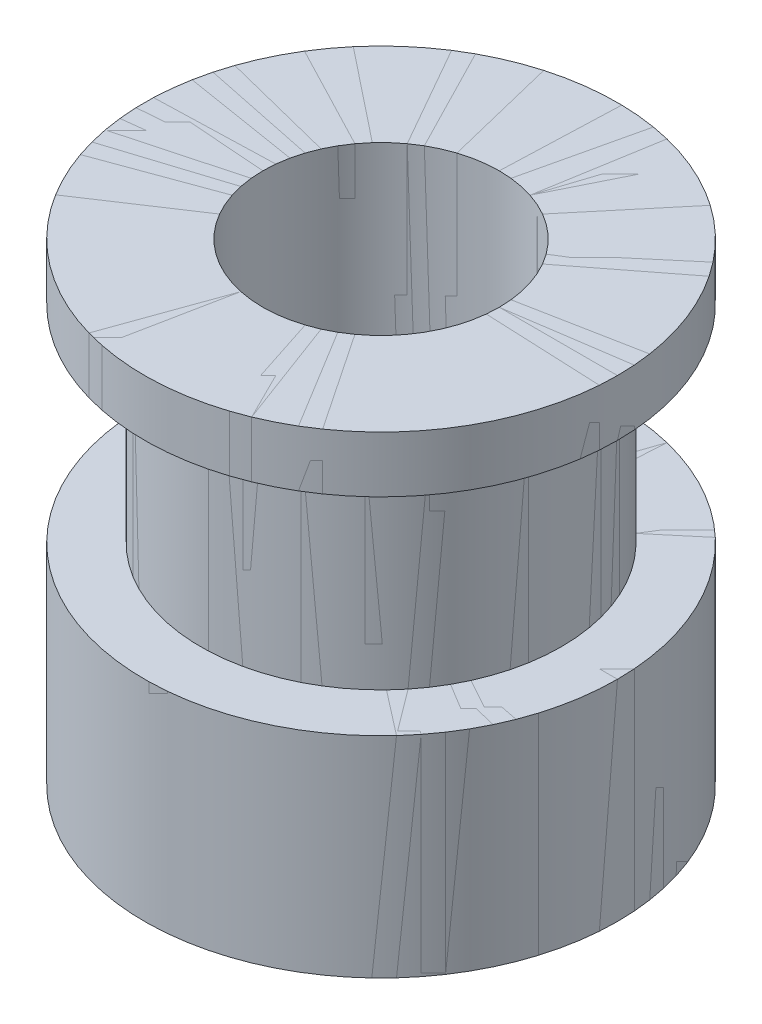
ISO-10303-21;
HEADER;
FILE_DESCRIPTION(('STEP AP214'),'2;1');
FILE_NAME('part.step','',(''),(''),'','','');
FILE_SCHEMA(('AUTOMOTIVE_DESIGN { 1 0 10303 214 1 1 1 1 }'));
ENDSEC;
DATA;
#1=APPLICATION_CONTEXT('core data for automotive mechanical design processes');
#2=APPLICATION_PROTOCOL_DEFINITION('international standard','automotive_design',2000,#1);
#3=PRODUCT_CONTEXT('',#1,'mechanical');
#4=PRODUCT('Part','Part','',(#3));
#5=PRODUCT_RELATED_PRODUCT_CATEGORY('part','',(#4));
#6=PRODUCT_DEFINITION_FORMATION('','',#4);
#7=PRODUCT_DEFINITION_CONTEXT('part definition',#1,'design');
#8=PRODUCT_DEFINITION('design','',#6,#7);
#9=PRODUCT_DEFINITION_SHAPE('','',#8);
#10=(LENGTH_UNIT() NAMED_UNIT(*) SI_UNIT(.MILLI.,.METRE.));
#11=(NAMED_UNIT(*) PLANE_ANGLE_UNIT() SI_UNIT($,.RADIAN.));
#12=(NAMED_UNIT(*) SI_UNIT($,.STERADIAN.) SOLID_ANGLE_UNIT());
#13=UNCERTAINTY_MEASURE_WITH_UNIT(LENGTH_MEASURE(1.E-05),#10,'distance_accuracy_value','');
#14=(GEOMETRIC_REPRESENTATION_CONTEXT(3) GLOBAL_UNCERTAINTY_ASSIGNED_CONTEXT((#13)) GLOBAL_UNIT_ASSIGNED_CONTEXT((#10,
#11,#12)) REPRESENTATION_CONTEXT('',''));
#15=CARTESIAN_POINT('',(0.,0.,0.));
#16=DIRECTION('',(0.,0.,1.));
#17=DIRECTION('',(1.,0.,0.));
#18=AXIS2_PLACEMENT_3D('',#15,#16,#17);
#19=CARTESIAN_POINT('',(0.,0.,0.));
#20=DIRECTION('',(0.,-1.,0.));
#21=DIRECTION('',(1.,0.,0.));
#22=AXIS2_PLACEMENT_3D('',#19,#20,#21);
#23=CYLINDRICAL_SURFACE('',#22,6.1);
#24=CARTESIAN_POINT('',(0.,6.1,0.));
#25=DIRECTION('',(0.,-1.,0.));
#26=DIRECTION('',(1.,0.,0.));
#27=AXIS2_PLACEMENT_3D('',#24,#25,#26);
#28=CIRCLE('',#27,6.1);
#29=CARTESIAN_POINT('',(6.1,6.1,0.));
#30=VERTEX_POINT('',#29);
#31=EDGE_CURVE('E11',#30,#30,#28,.T.);
#32=ORIENTED_EDGE('',*,*,#31,.T.);
#33=EDGE_LOOP('',(#32));
#34=FACE_BOUND('',#33,.T.);
#35=CARTESIAN_POINT('',(0.,-0.900000000000002,0.));
#36=DIRECTION('',(0.,-1.,0.));
#37=DIRECTION('',(1.,0.,0.));
#38=AXIS2_PLACEMENT_3D('',#35,#36,#37);
#39=CIRCLE('',#38,6.1);
#40=CARTESIAN_POINT('',(6.1,-0.900000000000001,0.));
#41=VERTEX_POINT('',#40);
#42=EDGE_CURVE('E75',#41,#41,#39,.T.);
#43=ORIENTED_EDGE('',*,*,#42,.F.);
#44=EDGE_LOOP('',(#43));
#45=FACE_BOUND('',#44,.T.);
#46=ADVANCED_FACE('F47',(#34,#45),#23,.T.);
#47=CARTESIAN_POINT('',(0.,6.1,0.));
#48=DIRECTION('',(0.,-1.,0.));
#49=DIRECTION('',(1.,0.,0.));
#50=AXIS2_PLACEMENT_3D('',#47,#48,#49);
#51=PLANE('',#50);
#52=CARTESIAN_POINT('',(0.,6.1,0.));
#53=DIRECTION('',(0.,-1.,0.));
#54=DIRECTION('',(1.,0.,0.));
#55=AXIS2_PLACEMENT_3D('',#52,#53,#54);
#56=CIRCLE('',#55,8.);
#57=CARTESIAN_POINT('',(8.,6.1,0.));
#58=VERTEX_POINT('',#57);
#59=EDGE_CURVE('E53',#58,#58,#56,.T.);
#60=ORIENTED_EDGE('',*,*,#59,.T.);
#61=EDGE_LOOP('',(#60));
#62=FACE_BOUND('',#61,.T.);
#63=ORIENTED_EDGE('',*,*,#31,.F.);
#64=EDGE_LOOP('',(#63));
#65=FACE_BOUND('',#64,.T.);
#66=ADVANCED_FACE('F82',(#62,#65),#51,.T.);
#67=CARTESIAN_POINT('',(0.,0.,0.));
#68=DIRECTION('',(0.,-1.,0.));
#69=DIRECTION('',(1.,0.,0.));
#70=AXIS2_PLACEMENT_3D('',#67,#68,#69);
#71=CYLINDRICAL_SURFACE('',#70,8.);
#72=CARTESIAN_POINT('',(0.,8.,0.));
#73=DIRECTION('',(0.,-1.,0.));
#74=DIRECTION('',(1.,0.,0.));
#75=AXIS2_PLACEMENT_3D('',#72,#73,#74);
#76=CIRCLE('',#75,8.);
#77=CARTESIAN_POINT('',(8.,8.,0.));
#78=VERTEX_POINT('',#77);
#79=EDGE_CURVE('E57',#78,#78,#76,.T.);
#80=ORIENTED_EDGE('',*,*,#79,.T.);
#81=EDGE_LOOP('',(#80));
#82=FACE_BOUND('',#81,.T.);
#83=ORIENTED_EDGE('',*,*,#59,.F.);
#84=EDGE_LOOP('',(#83));
#85=FACE_BOUND('',#84,.T.);
#86=ADVANCED_FACE('F86',(#82,#85),#71,.T.);
#87=CARTESIAN_POINT('',(0.,8.,0.));
#88=DIRECTION('',(0.,-1.,0.));
#89=DIRECTION('',(1.,0.,0.));
#90=AXIS2_PLACEMENT_3D('',#87,#88,#89);
#91=PLANE('',#90);
#92=ORIENTED_EDGE('',*,*,#79,.F.);
#93=EDGE_LOOP('',(#92));
#94=FACE_BOUND('',#93,.T.);
#95=CARTESIAN_POINT('',(0.,8.,0.));
#96=DIRECTION('',(0.,-1.,0.));
#97=DIRECTION('',(1.,0.,0.));
#98=AXIS2_PLACEMENT_3D('',#95,#96,#97);
#99=CIRCLE('',#98,4.);
#100=CARTESIAN_POINT('',(4.,8.,0.));
#101=VERTEX_POINT('',#100);
#102=EDGE_CURVE('E61',#101,#101,#99,.T.);
#103=ORIENTED_EDGE('',*,*,#102,.T.);
#104=EDGE_LOOP('',(#103));
#105=FACE_BOUND('',#104,.T.);
#106=ADVANCED_FACE('F90',(#94,#105),#91,.F.);
#107=CARTESIAN_POINT('',(0.,0.,0.));
#108=DIRECTION('',(0.,-1.,0.));
#109=DIRECTION('',(1.,0.,0.));
#110=AXIS2_PLACEMENT_3D('',#107,#108,#109);
#111=CYLINDRICAL_SURFACE('',#110,4.);
#112=ORIENTED_EDGE('',*,*,#102,.F.);
#113=EDGE_LOOP('',(#112));
#114=FACE_BOUND('',#113,.T.);
#115=CARTESIAN_POINT('',(0.,-8.,0.));
#116=DIRECTION('',(0.,-1.,0.));
#117=DIRECTION('',(1.,0.,0.));
#118=AXIS2_PLACEMENT_3D('',#115,#116,#117);
#119=CIRCLE('',#118,4.);
#120=CARTESIAN_POINT('',(4.,-8.,0.));
#121=VERTEX_POINT('',#120);
#122=EDGE_CURVE('E66',#121,#121,#119,.T.);
#123=ORIENTED_EDGE('',*,*,#122,.T.);
#124=EDGE_LOOP('',(#123));
#125=FACE_BOUND('',#124,.T.);
#126=ADVANCED_FACE('F97',(#114,#125),#111,.F.);
#127=CARTESIAN_POINT('',(0.,-8.,0.));
#128=DIRECTION('',(0.,-1.,0.));
#129=DIRECTION('',(1.,0.,0.));
#130=AXIS2_PLACEMENT_3D('',#127,#128,#129);
#131=PLANE('',#130);
#132=CARTESIAN_POINT('',(0.,-8.,0.));
#133=DIRECTION('',(0.,-1.,0.));
#134=DIRECTION('',(1.,0.,0.));
#135=AXIS2_PLACEMENT_3D('',#132,#133,#134);
#136=CIRCLE('',#135,8.);
#137=CARTESIAN_POINT('',(8.,-8.,0.));
#138=VERTEX_POINT('',#137);
#139=EDGE_CURVE('E69',#138,#138,#136,.T.);
#140=ORIENTED_EDGE('',*,*,#139,.T.);
#141=EDGE_LOOP('',(#140));
#142=FACE_BOUND('',#141,.T.);
#143=ORIENTED_EDGE('',*,*,#122,.F.);
#144=EDGE_LOOP('',(#143));
#145=FACE_BOUND('',#144,.T.);
#146=ADVANCED_FACE('F101',(#142,#145),#131,.T.);
#147=CARTESIAN_POINT('',(0.,0.,0.));
#148=DIRECTION('',(0.,-1.,0.));
#149=DIRECTION('',(1.,0.,0.));
#150=AXIS2_PLACEMENT_3D('',#147,#148,#149);
#151=CYLINDRICAL_SURFACE('',#150,8.);
#152=ORIENTED_EDGE('',*,*,#139,.F.);
#153=EDGE_LOOP('',(#152));
#154=FACE_BOUND('',#153,.T.);
#155=CARTESIAN_POINT('',(0.,-0.899999999999999,0.));
#156=DIRECTION('',(0.,-1.,0.));
#157=DIRECTION('',(1.,0.,0.));
#158=AXIS2_PLACEMENT_3D('',#155,#156,#157);
#159=CIRCLE('',#158,8.);
#160=CARTESIAN_POINT('',(8.,-0.899999999999997,0.));
#161=VERTEX_POINT('',#160);
#162=EDGE_CURVE('E72',#161,#161,#159,.T.);
#163=ORIENTED_EDGE('',*,*,#162,.T.);
#164=EDGE_LOOP('',(#163));
#165=FACE_BOUND('',#164,.T.);
#166=ADVANCED_FACE('F105',(#154,#165),#151,.T.);
#167=CARTESIAN_POINT('',(0.,-0.9,0.));
#168=DIRECTION('',(0.,-1.,0.));
#169=DIRECTION('',(1.,0.,0.));
#170=AXIS2_PLACEMENT_3D('',#167,#168,#169);
#171=PLANE('',#170);
#172=ORIENTED_EDGE('',*,*,#162,.F.);
#173=EDGE_LOOP('',(#172));
#174=FACE_BOUND('',#173,.T.);
#175=ORIENTED_EDGE('',*,*,#42,.T.);
#176=EDGE_LOOP('',(#175));
#177=FACE_BOUND('',#176,.T.);
#178=ADVANCED_FACE('F79',(#174,#177),#171,.F.);
#179=CLOSED_SHELL('',(#46,#66,#86,#106,#126,#146,#166,#178));
#180=MANIFOLD_SOLID_BREP('B2',#179);
#181=CARTESIAN_POINT('',(0.,0.,0.));
#182=DIRECTION('',(0.,-1.,0.));
#183=DIRECTION('',(1.,0.,0.));
#184=AXIS2_PLACEMENT_3D('',#181,#182,#183);
#185=CYLINDRICAL_SURFACE('',#184,8.);
#186=CARTESIAN_POINT('',(0.,8.,0.));
#187=DIRECTION('',(0.,-1.,0.));
#188=DIRECTION('',(1.,0.,0.));
#189=AXIS2_PLACEMENT_3D('',#186,#187,#188);
#190=CIRCLE('',#189,8.);
#191=CARTESIAN_POINT('',(8.,8.,0.));
#192=VERTEX_POINT('',#191);
#193=EDGE_CURVE('E197',#192,#192,#190,.T.);
#194=ORIENTED_EDGE('',*,*,#193,.T.);
#195=EDGE_LOOP('',(#194));
#196=FACE_BOUND('',#195,.T.);
#197=CARTESIAN_POINT('',(0.,6.1,0.));
#198=DIRECTION('',(0.,-1.,0.));
#199=DIRECTION('',(1.,0.,0.));
#200=AXIS2_PLACEMENT_3D('',#197,#198,#199);
#201=CIRCLE('',#200,8.);
#202=CARTESIAN_POINT('',(8.,6.1,0.));
#203=VERTEX_POINT('',#202);
#204=EDGE_CURVE('E46',#203,#203,#201,.T.);
#205=ORIENTED_EDGE('',*,*,#204,.F.);
#206=EDGE_LOOP('',(#205));
#207=FACE_BOUND('',#206,.T.);
#208=ADVANCED_FACE('F169',(#196,#207),#185,.T.);
#209=CARTESIAN_POINT('',(0.,6.1,0.));
#210=DIRECTION('',(0.,-1.,0.));
#211=DIRECTION('',(1.,0.,0.));
#212=AXIS2_PLACEMENT_3D('',#209,#210,#211);
#213=PLANE('',#212);
#214=ORIENTED_EDGE('',*,*,#204,.T.);
#215=EDGE_LOOP('',(#214));
#216=FACE_BOUND('',#215,.T.);
#217=CARTESIAN_POINT('',(0.,6.1,0.));
#218=DIRECTION('',(0.,-1.,0.));
#219=DIRECTION('',(1.,0.,0.));
#220=AXIS2_PLACEMENT_3D('',#217,#218,#219);
#221=CIRCLE('',#220,6.1);
#222=CARTESIAN_POINT('',(6.1,6.1,0.));
#223=VERTEX_POINT('',#222);
#224=EDGE_CURVE('E175',#223,#223,#221,.T.);
#225=ORIENTED_EDGE('',*,*,#224,.F.);
#226=EDGE_LOOP('',(#225));
#227=FACE_BOUND('',#226,.T.);
#228=ADVANCED_FACE('F215',(#216,#227),#213,.T.);
#229=CARTESIAN_POINT('',(0.,0.,0.));
#230=DIRECTION('',(0.,-1.,0.));
#231=DIRECTION('',(1.,0.,0.));
#232=AXIS2_PLACEMENT_3D('',#229,#230,#231);
#233=CYLINDRICAL_SURFACE('',#232,6.1);
#234=ORIENTED_EDGE('',*,*,#224,.T.);
#235=EDGE_LOOP('',(#234));
#236=FACE_BOUND('',#235,.T.);
#237=CARTESIAN_POINT('',(0.,-0.899999999999999,0.));
#238=DIRECTION('',(0.,-1.,0.));
#239=DIRECTION('',(1.,0.,0.));
#240=AXIS2_PLACEMENT_3D('',#237,#238,#239);
#241=CIRCLE('',#240,6.1);
#242=CARTESIAN_POINT('',(6.1,-0.899999999999998,0.));
#243=VERTEX_POINT('',#242);
#244=EDGE_CURVE('E179',#243,#243,#241,.T.);
#245=ORIENTED_EDGE('',*,*,#244,.F.);
#246=EDGE_LOOP('',(#245));
#247=FACE_BOUND('',#246,.T.);
#248=ADVANCED_FACE('F219',(#236,#247),#233,.T.);
#249=CARTESIAN_POINT('',(0.,-0.899999999999999,0.));
#250=DIRECTION('',(0.,-1.,0.));
#251=DIRECTION('',(1.,0.,0.));
#252=AXIS2_PLACEMENT_3D('',#249,#250,#251);
#253=PLANE('',#252);
#254=CARTESIAN_POINT('',(0.,-0.899999999999999,0.));
#255=DIRECTION('',(0.,-1.,0.));
#256=DIRECTION('',(1.,0.,0.));
#257=AXIS2_PLACEMENT_3D('',#254,#255,#256);
#258=CIRCLE('',#257,8.);
#259=CARTESIAN_POINT('',(8.,-0.899999999999997,0.));
#260=VERTEX_POINT('',#259);
#261=EDGE_CURVE('E183',#260,#260,#258,.T.);
#262=ORIENTED_EDGE('',*,*,#261,.F.);
#263=EDGE_LOOP('',(#262));
#264=FACE_BOUND('',#263,.T.);
#265=ORIENTED_EDGE('',*,*,#244,.T.);
#266=EDGE_LOOP('',(#265));
#267=FACE_BOUND('',#266,.T.);
#268=ADVANCED_FACE('F223',(#264,#267),#253,.F.);
#269=CARTESIAN_POINT('',(0.,0.,0.));
#270=DIRECTION('',(0.,-1.,0.));
#271=DIRECTION('',(1.,0.,0.));
#272=AXIS2_PLACEMENT_3D('',#269,#270,#271);
#273=CYLINDRICAL_SURFACE('',#272,8.);
#274=CARTESIAN_POINT('',(0.,-8.,0.));
#275=DIRECTION('',(0.,-1.,0.));
#276=DIRECTION('',(1.,0.,0.));
#277=AXIS2_PLACEMENT_3D('',#274,#275,#276);
#278=CIRCLE('',#277,8.);
#279=CARTESIAN_POINT('',(8.00000000000001,-8.,0.));
#280=VERTEX_POINT('',#279);
#281=EDGE_CURVE('E188',#280,#280,#278,.T.);
#282=ORIENTED_EDGE('',*,*,#281,.F.);
#283=EDGE_LOOP('',(#282));
#284=FACE_BOUND('',#283,.T.);
#285=ORIENTED_EDGE('',*,*,#261,.T.);
#286=EDGE_LOOP('',(#285));
#287=FACE_BOUND('',#286,.T.);
#288=ADVANCED_FACE('F229',(#284,#287),#273,.T.);
#289=CARTESIAN_POINT('',(0.,-8.,0.));
#290=DIRECTION('',(0.,1.,0.));
#291=DIRECTION('',(-1.,0.,0.));
#292=AXIS2_PLACEMENT_3D('',#289,#290,#291);
#293=PLANE('',#292);
#294=CARTESIAN_POINT('',(0.,-8.,0.));
#295=DIRECTION('',(0.,-1.,0.));
#296=DIRECTION('',(1.,0.,0.));
#297=AXIS2_PLACEMENT_3D('',#294,#295,#296);
#298=CIRCLE('',#297,4.);
#299=CARTESIAN_POINT('',(4.00000000000001,-8.,0.));
#300=VERTEX_POINT('',#299);
#301=EDGE_CURVE('E191',#300,#300,#298,.T.);
#302=ORIENTED_EDGE('',*,*,#301,.F.);
#303=EDGE_LOOP('',(#302));
#304=FACE_BOUND('',#303,.T.);
#305=ORIENTED_EDGE('',*,*,#281,.T.);
#306=EDGE_LOOP('',(#305));
#307=FACE_BOUND('',#306,.T.);
#308=ADVANCED_FACE('F211',(#304,#307),#293,.F.);
#309=CARTESIAN_POINT('',(0.,0.,0.));
#310=DIRECTION('',(0.,-1.,0.));
#311=DIRECTION('',(1.,0.,0.));
#312=AXIS2_PLACEMENT_3D('',#309,#310,#311);
#313=CYLINDRICAL_SURFACE('',#312,4.);
#314=CARTESIAN_POINT('',(0.,8.,0.));
#315=DIRECTION('',(0.,-1.,0.));
#316=DIRECTION('',(1.,0.,0.));
#317=AXIS2_PLACEMENT_3D('',#314,#315,#316);
#318=CIRCLE('',#317,4.);
#319=CARTESIAN_POINT('',(4.,8.,0.));
#320=VERTEX_POINT('',#319);
#321=EDGE_CURVE('E194',#320,#320,#318,.T.);
#322=ORIENTED_EDGE('',*,*,#321,.F.);
#323=EDGE_LOOP('',(#322));
#324=FACE_BOUND('',#323,.T.);
#325=ORIENTED_EDGE('',*,*,#301,.T.);
#326=EDGE_LOOP('',(#325));
#327=FACE_BOUND('',#326,.T.);
#328=ADVANCED_FACE('F205',(#324,#327),#313,.F.);
#329=CARTESIAN_POINT('',(0.,8.,0.));
#330=DIRECTION('',(0.,1.,0.));
#331=DIRECTION('',(-1.,0.,0.));
#332=AXIS2_PLACEMENT_3D('',#329,#330,#331);
#333=PLANE('',#332);
#334=ORIENTED_EDGE('',*,*,#321,.T.);
#335=EDGE_LOOP('',(#334));
#336=FACE_BOUND('',#335,.T.);
#337=ORIENTED_EDGE('',*,*,#193,.F.);
#338=EDGE_LOOP('',(#337));
#339=FACE_BOUND('',#338,.T.);
#340=ADVANCED_FACE('F203',(#336,#339),#333,.T.);
#341=CLOSED_SHELL('',(#208,#228,#248,#268,#288,#308,#328,#340));
#342=MANIFOLD_SOLID_BREP('B6',#341);
#343=ADVANCED_BREP_SHAPE_REPRESENTATION('',(#18,#180,#342),#14);
#344=SHAPE_DEFINITION_REPRESENTATION(#9,#343);
ENDSEC;
END-ISO-10303-21;
